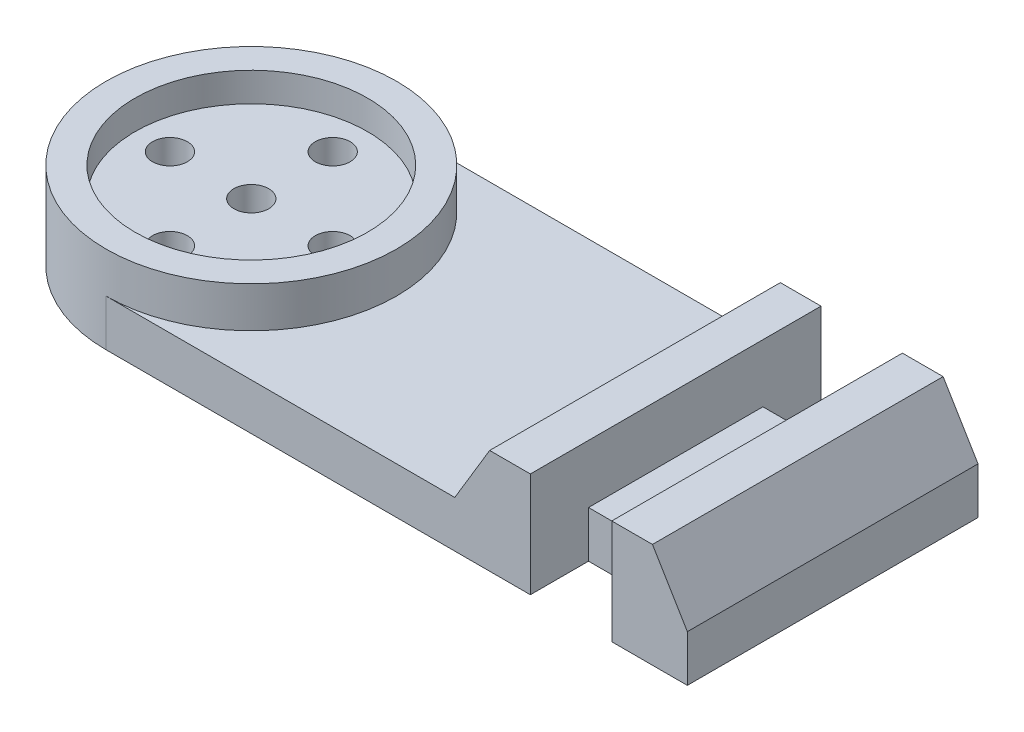
ISO-10303-21;
HEADER;
FILE_DESCRIPTION(('STEP AP214'),'2;1');
FILE_NAME('part.step','',(''),(''),'','','');
FILE_SCHEMA(('AUTOMOTIVE_DESIGN { 1 0 10303 214 1 1 1 1 }'));
ENDSEC;
DATA;
#1=APPLICATION_CONTEXT('core data for automotive mechanical design processes');
#2=APPLICATION_PROTOCOL_DEFINITION('international standard','automotive_design',2000,#1);
#3=PRODUCT_CONTEXT('',#1,'mechanical');
#4=PRODUCT('Part','Part','',(#3));
#5=PRODUCT_RELATED_PRODUCT_CATEGORY('part','',(#4));
#6=PRODUCT_DEFINITION_FORMATION('','',#4);
#7=PRODUCT_DEFINITION_CONTEXT('part definition',#1,'design');
#8=PRODUCT_DEFINITION('design','',#6,#7);
#9=PRODUCT_DEFINITION_SHAPE('','',#8);
#10=(LENGTH_UNIT() NAMED_UNIT(*) SI_UNIT(.MILLI.,.METRE.));
#11=(NAMED_UNIT(*) PLANE_ANGLE_UNIT() SI_UNIT($,.RADIAN.));
#12=(NAMED_UNIT(*) SI_UNIT($,.STERADIAN.) SOLID_ANGLE_UNIT());
#13=UNCERTAINTY_MEASURE_WITH_UNIT(LENGTH_MEASURE(1.E-05),#10,'distance_accuracy_value','');
#14=(GEOMETRIC_REPRESENTATION_CONTEXT(3) GLOBAL_UNCERTAINTY_ASSIGNED_CONTEXT((#13)) GLOBAL_UNIT_ASSIGNED_CONTEXT((#10,
#11,#12)) REPRESENTATION_CONTEXT('',''));
#15=CARTESIAN_POINT('',(0.,0.,0.));
#16=DIRECTION('',(0.,0.,1.));
#17=DIRECTION('',(1.,0.,0.));
#18=AXIS2_PLACEMENT_3D('',#15,#16,#17);
#19=CARTESIAN_POINT('',(0.,4.,12.5));
#20=DIRECTION('',(0.,0.,-1.));
#21=DIRECTION('',(-1.,0.,0.));
#22=AXIS2_PLACEMENT_3D('',#19,#20,#21);
#23=PLANE('',#22);
#24=DIRECTION('',(1.,0.,0.));
#25=VECTOR('',#24,1.);
#26=CARTESIAN_POINT('',(0.,0.,12.5));
#27=LINE('',#26,#25);
#28=CARTESIAN_POINT('',(0.,0.,12.5));
#29=VERTEX_POINT('',#28);
#30=CARTESIAN_POINT('',(36.5,0.,12.5));
#31=VERTEX_POINT('',#30);
#32=EDGE_CURVE('E159',#29,#31,#27,.T.);
#33=ORIENTED_EDGE('',*,*,#32,.T.);
#34=DIRECTION('',(0.,-1.,0.));
#35=VECTOR('',#34,1.);
#36=CARTESIAN_POINT('',(36.5,9.,12.5));
#37=LINE('',#36,#35);
#38=CARTESIAN_POINT('',(36.5,9.,12.5));
#39=VERTEX_POINT('',#38);
#40=EDGE_CURVE('E143',#39,#31,#37,.T.);
#41=ORIENTED_EDGE('',*,*,#40,.F.);
#42=DIRECTION('',(-1.,0.,0.));
#43=VECTOR('',#42,1.);
#44=CARTESIAN_POINT('',(47.,9.,12.5));
#45=LINE('',#44,#43);
#46=CARTESIAN_POINT('',(33.,9.,12.5));
#47=VERTEX_POINT('',#46);
#48=EDGE_CURVE('E268',#39,#47,#45,.T.);
#49=ORIENTED_EDGE('',*,*,#48,.T.);
#50=DIRECTION('',(-0.514495755427526,-0.857492925712544,0.));
#51=VECTOR('',#50,1.);
#52=CARTESIAN_POINT('',(30.,4.,12.5));
#53=LINE('',#52,#51);
#54=CARTESIAN_POINT('',(30.,4.,12.5));
#55=VERTEX_POINT('',#54);
#56=EDGE_CURVE('E216',#47,#55,#53,.T.);
#57=ORIENTED_EDGE('',*,*,#56,.T.);
#58=DIRECTION('',(1.,0.,0.));
#59=VECTOR('',#58,1.);
#60=CARTESIAN_POINT('',(0.,4.,12.5));
#61=LINE('',#60,#59);
#62=CARTESIAN_POINT('',(0.,4.,12.5));
#63=VERTEX_POINT('',#62);
#64=EDGE_CURVE('E181',#63,#55,#61,.T.);
#65=ORIENTED_EDGE('',*,*,#64,.F.);
#66=DIRECTION('',(0.,-1.,0.));
#67=VECTOR('',#66,1.);
#68=CARTESIAN_POINT('',(0.,4.,12.5));
#69=LINE('',#68,#67);
#70=EDGE_CURVE('E45',#63,#29,#69,.T.);
#71=ORIENTED_EDGE('',*,*,#70,.T.);
#72=EDGE_LOOP('',(#33,#41,#49,#57,#65,#71));
#73=FACE_BOUND('',#72,.T.);
#74=ADVANCED_FACE('F37',(#73),#23,.F.);
#75=CARTESIAN_POINT('',(0.,4.,-12.5));
#76=DIRECTION('',(0.,0.,-1.));
#77=DIRECTION('',(-1.,0.,0.));
#78=AXIS2_PLACEMENT_3D('',#75,#76,#77);
#79=PLANE('',#78);
#80=DIRECTION('',(0.,-1.,0.));
#81=VECTOR('',#80,1.);
#82=CARTESIAN_POINT('',(36.5,9.,-12.5));
#83=LINE('',#82,#81);
#84=CARTESIAN_POINT('',(36.5,9.,-12.5));
#85=VERTEX_POINT('',#84);
#86=CARTESIAN_POINT('',(36.5,0.,-12.5));
#87=VERTEX_POINT('',#86);
#88=EDGE_CURVE('E60',#85,#87,#83,.T.);
#89=ORIENTED_EDGE('',*,*,#88,.T.);
#90=DIRECTION('',(1.,0.,0.));
#91=VECTOR('',#90,1.);
#92=CARTESIAN_POINT('',(0.,0.,-12.5));
#93=LINE('',#92,#91);
#94=CARTESIAN_POINT('',(0.,0.,-12.5));
#95=VERTEX_POINT('',#94);
#96=EDGE_CURVE('E178',#95,#87,#93,.T.);
#97=ORIENTED_EDGE('',*,*,#96,.F.);
#98=DIRECTION('',(0.,-1.,0.));
#99=VECTOR('',#98,1.);
#100=CARTESIAN_POINT('',(0.,4.,-12.5));
#101=LINE('',#100,#99);
#102=CARTESIAN_POINT('',(0.,4.,-12.5));
#103=VERTEX_POINT('',#102);
#104=EDGE_CURVE('E182',#103,#95,#101,.T.);
#105=ORIENTED_EDGE('',*,*,#104,.F.);
#106=DIRECTION('',(1.,0.,0.));
#107=VECTOR('',#106,1.);
#108=CARTESIAN_POINT('',(0.,4.,-12.5));
#109=LINE('',#108,#107);
#110=CARTESIAN_POINT('',(30.,4.,-12.5));
#111=VERTEX_POINT('',#110);
#112=EDGE_CURVE('E185',#103,#111,#109,.T.);
#113=ORIENTED_EDGE('',*,*,#112,.T.);
#114=DIRECTION('',(-0.514495755427526,-0.857492925712544,0.));
#115=VECTOR('',#114,1.);
#116=CARTESIAN_POINT('',(30.,4.,-12.5));
#117=LINE('',#116,#115);
#118=CARTESIAN_POINT('',(33.,9.,-12.5));
#119=VERTEX_POINT('',#118);
#120=EDGE_CURVE('E261',#119,#111,#117,.T.);
#121=ORIENTED_EDGE('',*,*,#120,.F.);
#122=DIRECTION('',(-1.,0.,0.));
#123=VECTOR('',#122,1.);
#124=CARTESIAN_POINT('',(47.,9.,-12.5));
#125=LINE('',#124,#123);
#126=EDGE_CURVE('E257',#85,#119,#125,.T.);
#127=ORIENTED_EDGE('',*,*,#126,.F.);
#128=EDGE_LOOP('',(#89,#97,#105,#113,#121,#127));
#129=FACE_BOUND('',#128,.T.);
#130=ADVANCED_FACE('F337',(#129),#79,.T.);
#131=CARTESIAN_POINT('',(47.,9.,-33.1155281280883));
#132=DIRECTION('',(0.,1.,0.));
#133=DIRECTION('',(-1.,0.,0.));
#134=AXIS2_PLACEMENT_3D('',#131,#132,#133);
#135=PLANE('',#134);
#136=DIRECTION('',(0.,0.,1.));
#137=VECTOR('',#136,1.);
#138=CARTESIAN_POINT('',(43.5,9.,-12.5));
#139=LINE('',#138,#137);
#140=CARTESIAN_POINT('',(43.5,9.,-12.5));
#141=VERTEX_POINT('',#140);
#142=CARTESIAN_POINT('',(43.5,9.,12.5));
#143=VERTEX_POINT('',#142);
#144=EDGE_CURVE('E274',#141,#143,#139,.T.);
#145=ORIENTED_EDGE('',*,*,#144,.T.);
#146=CARTESIAN_POINT('',(47.,9.,12.5));
#147=VERTEX_POINT('',#146);
#148=EDGE_CURVE('E269',#147,#143,#45,.T.);
#149=ORIENTED_EDGE('',*,*,#148,.F.);
#150=DIRECTION('',(0.,0.,1.));
#151=VECTOR('',#150,1.);
#152=CARTESIAN_POINT('',(47.,9.,-33.1155281280883));
#153=LINE('',#152,#151);
#154=CARTESIAN_POINT('',(47.,9.,-12.5));
#155=VERTEX_POINT('',#154);
#156=EDGE_CURVE('E215',#155,#147,#153,.T.);
#157=ORIENTED_EDGE('',*,*,#156,.F.);
#158=EDGE_CURVE('E212',#155,#141,#125,.T.);
#159=ORIENTED_EDGE('',*,*,#158,.T.);
#160=EDGE_LOOP('',(#145,#149,#157,#159));
#161=FACE_BOUND('',#160,.T.);
#162=ADVANCED_FACE('F342',(#161),#135,.T.);
#163=CARTESIAN_POINT('',(0.,4.,0.));
#164=DIRECTION('',(0.,-1.,0.));
#165=DIRECTION('',(0.,0.,-1.));
#166=AXIS2_PLACEMENT_3D('',#163,#164,#165);
#167=CYLINDRICAL_SURFACE('',#166,12.5);
#168=CARTESIAN_POINT('',(0.,0.,0.));
#169=DIRECTION('',(0.,1.,0.));
#170=DIRECTION('',(0.,0.,1.));
#171=AXIS2_PLACEMENT_3D('',#168,#169,#170);
#172=CIRCLE('',#171,12.5);
#173=EDGE_CURVE('E174',#95,#29,#172,.T.);
#174=ORIENTED_EDGE('',*,*,#173,.T.);
#175=ORIENTED_EDGE('',*,*,#70,.F.);
#176=CARTESIAN_POINT('',(0.,4.,0.));
#177=DIRECTION('',(0.,1.,0.));
#178=DIRECTION('',(0.,0.,1.));
#179=AXIS2_PLACEMENT_3D('',#176,#177,#178);
#180=CIRCLE('',#179,12.5);
#181=EDGE_CURVE('E224',#63,#103,#180,.T.);
#182=ORIENTED_EDGE('',*,*,#181,.T.);
#183=ORIENTED_EDGE('',*,*,#104,.T.);
#184=EDGE_LOOP('',(#174,#175,#182,#183));
#185=FACE_BOUND('',#184,.T.);
#186=CARTESIAN_POINT('',(0.,7.5,0.));
#187=DIRECTION('',(0.,1.,0.));
#188=DIRECTION('',(0.,0.,1.));
#189=AXIS2_PLACEMENT_3D('',#186,#187,#188);
#190=CIRCLE('',#189,12.5);
#191=CARTESIAN_POINT('',(0.,7.5,12.5));
#192=VERTEX_POINT('',#191);
#193=EDGE_CURVE('E227',#192,#192,#190,.T.);
#194=ORIENTED_EDGE('',*,*,#193,.F.);
#195=EDGE_LOOP('',(#194));
#196=FACE_BOUND('',#195,.T.);
#197=ADVANCED_FACE('F39',(#185,#196),#167,.T.);
#198=DIRECTION('',(0.,1.,0.));
#199=VECTOR('',#198,1.);
#200=CARTESIAN_POINT('',(43.5,9.,12.5));
#201=LINE('',#200,#199);
#202=CARTESIAN_POINT('',(43.5,0.,12.5));
#203=VERTEX_POINT('',#202);
#204=EDGE_CURVE('E153',#203,#143,#201,.T.);
#205=ORIENTED_EDGE('',*,*,#204,.F.);
#206=CARTESIAN_POINT('',(50.,0.,12.5));
#207=VERTEX_POINT('',#206);
#208=EDGE_CURVE('E169',#203,#207,#27,.T.);
#209=ORIENTED_EDGE('',*,*,#208,.T.);
#210=DIRECTION('',(0.,-1.,0.));
#211=VECTOR('',#210,1.);
#212=CARTESIAN_POINT('',(50.,4.,12.5));
#213=LINE('',#212,#211);
#214=CARTESIAN_POINT('',(50.,4.,12.5));
#215=VERTEX_POINT('',#214);
#216=EDGE_CURVE('E188',#215,#207,#213,.T.);
#217=ORIENTED_EDGE('',*,*,#216,.F.);
#218=DIRECTION('',(-0.514495755427527,0.857492925712544,0.));
#219=VECTOR('',#218,1.);
#220=CARTESIAN_POINT('',(50.,4.,12.5));
#221=LINE('',#220,#219);
#222=EDGE_CURVE('E219',#215,#147,#221,.T.);
#223=ORIENTED_EDGE('',*,*,#222,.T.);
#224=ORIENTED_EDGE('',*,*,#148,.T.);
#225=EDGE_LOOP('',(#205,#209,#217,#223,#224));
#226=FACE_BOUND('',#225,.T.);
#227=ADVANCED_FACE('F338',(#226),#23,.F.);
#228=CARTESIAN_POINT('',(50.,4.,0.));
#229=DIRECTION('',(1.,0.,0.));
#230=DIRECTION('',(0.,0.,-1.));
#231=AXIS2_PLACEMENT_3D('',#228,#229,#230);
#232=PLANE('',#231);
#233=DIRECTION('',(0.,0.,1.));
#234=VECTOR('',#233,1.);
#235=CARTESIAN_POINT('',(50.,0.,0.));
#236=LINE('',#235,#234);
#237=CARTESIAN_POINT('',(50.,0.,-12.5));
#238=VERTEX_POINT('',#237);
#239=EDGE_CURVE('E168',#238,#207,#236,.T.);
#240=ORIENTED_EDGE('',*,*,#239,.F.);
#241=DIRECTION('',(0.,-1.,0.));
#242=VECTOR('',#241,1.);
#243=CARTESIAN_POINT('',(50.,4.,-12.5));
#244=LINE('',#243,#242);
#245=CARTESIAN_POINT('',(50.,4.,-12.5));
#246=VERTEX_POINT('',#245);
#247=EDGE_CURVE('E184',#246,#238,#244,.T.);
#248=ORIENTED_EDGE('',*,*,#247,.F.);
#249=DIRECTION('',(0.,0.,1.));
#250=VECTOR('',#249,1.);
#251=CARTESIAN_POINT('',(50.,4.,0.));
#252=LINE('',#251,#250);
#253=EDGE_CURVE('E195',#246,#215,#252,.T.);
#254=ORIENTED_EDGE('',*,*,#253,.T.);
#255=ORIENTED_EDGE('',*,*,#216,.T.);
#256=EDGE_LOOP('',(#240,#248,#254,#255));
#257=FACE_BOUND('',#256,.T.);
#258=ADVANCED_FACE('F193',(#257),#232,.T.);
#259=CARTESIAN_POINT('',(43.5,0.,-12.5));
#260=VERTEX_POINT('',#259);
#261=EDGE_CURVE('E172',#260,#238,#93,.T.);
#262=ORIENTED_EDGE('',*,*,#261,.F.);
#263=DIRECTION('',(0.,1.,0.));
#264=VECTOR('',#263,1.);
#265=CARTESIAN_POINT('',(43.5,9.,-12.5));
#266=LINE('',#265,#264);
#267=EDGE_CURVE('E152',#260,#141,#266,.T.);
#268=ORIENTED_EDGE('',*,*,#267,.T.);
#269=ORIENTED_EDGE('',*,*,#158,.F.);
#270=DIRECTION('',(-0.514495755427527,0.857492925712544,0.));
#271=VECTOR('',#270,1.);
#272=CARTESIAN_POINT('',(50.,4.,-12.5));
#273=LINE('',#272,#271);
#274=EDGE_CURVE('E210',#246,#155,#273,.T.);
#275=ORIENTED_EDGE('',*,*,#274,.F.);
#276=ORIENTED_EDGE('',*,*,#247,.T.);
#277=EDGE_LOOP('',(#262,#268,#269,#275,#276));
#278=FACE_BOUND('',#277,.T.);
#279=ADVANCED_FACE('F208',(#278),#79,.T.);
#280=CARTESIAN_POINT('',(0.,4.,0.));
#281=DIRECTION('',(0.,1.,0.));
#282=DIRECTION('',(0.,0.,1.));
#283=AXIS2_PLACEMENT_3D('',#280,#281,#282);
#284=PLANE('',#283);
#285=DIRECTION('',(0.,0.,1.));
#286=VECTOR('',#285,1.);
#287=CARTESIAN_POINT('',(30.,4.,-33.1155281280883));
#288=LINE('',#287,#286);
#289=EDGE_CURVE('E241',#111,#55,#288,.T.);
#290=ORIENTED_EDGE('',*,*,#289,.F.);
#291=ORIENTED_EDGE('',*,*,#112,.F.);
#292=ORIENTED_EDGE('',*,*,#181,.F.);
#293=ORIENTED_EDGE('',*,*,#64,.T.);
#294=EDGE_LOOP('',(#290,#291,#292,#293));
#295=FACE_BOUND('',#294,.T.);
#296=ADVANCED_FACE('F376',(#295),#284,.T.);
#297=CARTESIAN_POINT('',(0.,0.,0.));
#298=DIRECTION('',(0.,1.,0.));
#299=DIRECTION('',(0.,0.,1.));
#300=AXIS2_PLACEMENT_3D('',#297,#298,#299);
#301=PLANE('',#300);
#302=DIRECTION('',(-1.,0.,0.));
#303=VECTOR('',#302,1.);
#304=CARTESIAN_POINT('',(43.5,0.,7.5));
#305=LINE('',#304,#303);
#306=CARTESIAN_POINT('',(43.5,0.,7.5));
#307=VERTEX_POINT('',#306);
#308=CARTESIAN_POINT('',(36.5,0.,7.5));
#309=VERTEX_POINT('',#308);
#310=EDGE_CURVE('E163',#307,#309,#305,.T.);
#311=ORIENTED_EDGE('',*,*,#310,.T.);
#312=DIRECTION('',(0.,0.,1.));
#313=VECTOR('',#312,1.);
#314=CARTESIAN_POINT('',(36.5,0.,7.5));
#315=LINE('',#314,#313);
#316=EDGE_CURVE('E146',#309,#31,#315,.T.);
#317=ORIENTED_EDGE('',*,*,#316,.T.);
#318=ORIENTED_EDGE('',*,*,#32,.F.);
#319=ORIENTED_EDGE('',*,*,#173,.F.);
#320=ORIENTED_EDGE('',*,*,#96,.T.);
#321=DIRECTION('',(0.,0.,1.));
#322=VECTOR('',#321,1.);
#323=CARTESIAN_POINT('',(36.5,0.,-7.5));
#324=LINE('',#323,#322);
#325=CARTESIAN_POINT('',(36.5,0.,-7.5));
#326=VERTEX_POINT('',#325);
#327=EDGE_CURVE('E294',#87,#326,#324,.T.);
#328=ORIENTED_EDGE('',*,*,#327,.T.);
#329=DIRECTION('',(1.,0.,0.));
#330=VECTOR('',#329,1.);
#331=CARTESIAN_POINT('',(43.5,0.,-7.5));
#332=LINE('',#331,#330);
#333=CARTESIAN_POINT('',(43.5,0.,-7.5));
#334=VERTEX_POINT('',#333);
#335=EDGE_CURVE('E297',#326,#334,#332,.T.);
#336=ORIENTED_EDGE('',*,*,#335,.T.);
#337=DIRECTION('',(0.,0.,-1.));
#338=VECTOR('',#337,1.);
#339=CARTESIAN_POINT('',(43.5,0.,-12.5));
#340=LINE('',#339,#338);
#341=EDGE_CURVE('E204',#334,#260,#340,.T.);
#342=ORIENTED_EDGE('',*,*,#341,.T.);
#343=ORIENTED_EDGE('',*,*,#261,.T.);
#344=ORIENTED_EDGE('',*,*,#239,.T.);
#345=ORIENTED_EDGE('',*,*,#208,.F.);
#346=DIRECTION('',(0.,0.,-1.));
#347=VECTOR('',#346,1.);
#348=CARTESIAN_POINT('',(43.5,0.,12.5));
#349=LINE('',#348,#347);
#350=EDGE_CURVE('E164',#203,#307,#349,.T.);
#351=ORIENTED_EDGE('',*,*,#350,.T.);
#352=EDGE_LOOP('',(#311,#317,#318,#319,#320,#328,#336,#342,#343,#344,#345,#351));
#353=FACE_BOUND('',#352,.T.);
#354=CARTESIAN_POINT('',(40.,0.,0.));
#355=DIRECTION('',(0.,-1.,0.));
#356=DIRECTION('',(0.,0.,-1.));
#357=AXIS2_PLACEMENT_3D('',#354,#355,#356);
#358=CIRCLE('',#357,1.5);
#359=CARTESIAN_POINT('',(40.,0.,-1.5));
#360=VERTEX_POINT('',#359);
#361=EDGE_CURVE('E237',#360,#360,#358,.T.);
#362=ORIENTED_EDGE('',*,*,#361,.F.);
#363=EDGE_LOOP('',(#362));
#364=FACE_BOUND('',#363,.T.);
#365=CARTESIAN_POINT('',(0.,0.,7.));
#366=DIRECTION('',(0.,-1.,0.));
#367=DIRECTION('',(0.,0.,-1.));
#368=AXIS2_PLACEMENT_3D('',#365,#366,#367);
#369=CIRCLE('',#368,1.5);
#370=CARTESIAN_POINT('',(0.,0.,5.5));
#371=VERTEX_POINT('',#370);
#372=EDGE_CURVE('E236',#371,#371,#369,.T.);
#373=ORIENTED_EDGE('',*,*,#372,.F.);
#374=EDGE_LOOP('',(#373));
#375=FACE_BOUND('',#374,.T.);
#376=CARTESIAN_POINT('',(7.,0.,0.));
#377=DIRECTION('',(0.,-1.,0.));
#378=DIRECTION('',(0.,0.,-1.));
#379=AXIS2_PLACEMENT_3D('',#376,#377,#378);
#380=CIRCLE('',#379,1.5);
#381=CARTESIAN_POINT('',(7.,0.,-1.50000000000003));
#382=VERTEX_POINT('',#381);
#383=EDGE_CURVE('E242',#382,#382,#380,.T.);
#384=ORIENTED_EDGE('',*,*,#383,.F.);
#385=EDGE_LOOP('',(#384));
#386=FACE_BOUND('',#385,.T.);
#387=CARTESIAN_POINT('',(3.96556555700551E-13,0.,-7.));
#388=DIRECTION('',(0.,-1.,0.));
#389=DIRECTION('',(0.,0.,-1.));
#390=AXIS2_PLACEMENT_3D('',#387,#388,#389);
#391=CIRCLE('',#390,1.50000000000043);
#392=CARTESIAN_POINT('',(3.96556555700551E-13,0.,-8.50000000000043));
#393=VERTEX_POINT('',#392);
#394=EDGE_CURVE('E245',#393,#393,#391,.T.);
#395=ORIENTED_EDGE('',*,*,#394,.F.);
#396=EDGE_LOOP('',(#395));
#397=FACE_BOUND('',#396,.T.);
#398=CARTESIAN_POINT('',(-7.,0.,0.));
#399=DIRECTION('',(0.,-1.,0.));
#400=DIRECTION('',(0.,0.,-1.));
#401=AXIS2_PLACEMENT_3D('',#398,#399,#400);
#402=CIRCLE('',#401,1.5);
#403=CARTESIAN_POINT('',(-7.,0.,-1.49999999999993));
#404=VERTEX_POINT('',#403);
#405=EDGE_CURVE('E240',#404,#404,#402,.T.);
#406=ORIENTED_EDGE('',*,*,#405,.F.);
#407=EDGE_LOOP('',(#406));
#408=FACE_BOUND('',#407,.T.);
#409=CARTESIAN_POINT('',(0.,0.,0.));
#410=DIRECTION('',(0.,-1.,0.));
#411=DIRECTION('',(0.,0.,-1.));
#412=AXIS2_PLACEMENT_3D('',#409,#410,#411);
#413=CIRCLE('',#412,1.5);
#414=CARTESIAN_POINT('',(0.,0.,-1.5));
#415=VERTEX_POINT('',#414);
#416=EDGE_CURVE('E233',#415,#415,#413,.T.);
#417=ORIENTED_EDGE('',*,*,#416,.F.);
#418=EDGE_LOOP('',(#417));
#419=FACE_BOUND('',#418,.T.);
#420=ADVANCED_FACE('F156',(#353,#364,#375,#386,#397,#408,#419),#301,.F.);
#421=CARTESIAN_POINT('',(0.,7.5,0.));
#422=DIRECTION('',(0.,1.,0.));
#423=DIRECTION('',(0.,0.,1.));
#424=AXIS2_PLACEMENT_3D('',#421,#422,#423);
#425=PLANE('',#424);
#426=ORIENTED_EDGE('',*,*,#193,.T.);
#427=EDGE_LOOP('',(#426));
#428=FACE_BOUND('',#427,.T.);
#429=CARTESIAN_POINT('',(0.,7.5,0.));
#430=DIRECTION('',(0.,1.,0.));
#431=DIRECTION('',(0.,0.,1.));
#432=AXIS2_PLACEMENT_3D('',#429,#430,#431);
#433=CIRCLE('',#432,10.);
#434=CARTESIAN_POINT('',(0.,7.5,10.));
#435=VERTEX_POINT('',#434);
#436=EDGE_CURVE('E228',#435,#435,#433,.T.);
#437=ORIENTED_EDGE('',*,*,#436,.F.);
#438=EDGE_LOOP('',(#437));
#439=FACE_BOUND('',#438,.T.);
#440=ADVANCED_FACE('F380',(#428,#439),#425,.T.);
#441=CARTESIAN_POINT('',(0.,7.5,0.));
#442=DIRECTION('',(0.,-1.,0.));
#443=DIRECTION('',(0.,0.,-1.));
#444=AXIS2_PLACEMENT_3D('',#441,#442,#443);
#445=CYLINDRICAL_SURFACE('',#444,10.);
#446=CARTESIAN_POINT('',(0.,5.,0.));
#447=DIRECTION('',(0.,1.,0.));
#448=DIRECTION('',(0.,0.,1.));
#449=AXIS2_PLACEMENT_3D('',#446,#447,#448);
#450=CIRCLE('',#449,10.);
#451=CARTESIAN_POINT('',(0.,5.,10.));
#452=VERTEX_POINT('',#451);
#453=EDGE_CURVE('E11',#452,#452,#450,.T.);
#454=ORIENTED_EDGE('',*,*,#453,.F.);
#455=EDGE_LOOP('',(#454));
#456=FACE_BOUND('',#455,.T.);
#457=ORIENTED_EDGE('',*,*,#436,.T.);
#458=EDGE_LOOP('',(#457));
#459=FACE_BOUND('',#458,.T.);
#460=ADVANCED_FACE('F383',(#456,#459),#445,.F.);
#461=CARTESIAN_POINT('',(0.,7.5,0.));
#462=DIRECTION('',(0.,-1.,0.));
#463=DIRECTION('',(0.,0.,-1.));
#464=AXIS2_PLACEMENT_3D('',#461,#462,#463);
#465=CYLINDRICAL_SURFACE('',#464,1.5);
#466=ORIENTED_EDGE('',*,*,#416,.T.);
#467=EDGE_LOOP('',(#466));
#468=FACE_BOUND('',#467,.T.);
#469=CARTESIAN_POINT('',(0.,5.,0.));
#470=DIRECTION('',(0.,1.,0.));
#471=DIRECTION('',(0.,0.,1.));
#472=AXIS2_PLACEMENT_3D('',#469,#470,#471);
#473=CIRCLE('',#472,1.5);
#474=CARTESIAN_POINT('',(0.,5.,1.5));
#475=VERTEX_POINT('',#474);
#476=EDGE_CURVE('E295',#475,#475,#473,.T.);
#477=ORIENTED_EDGE('',*,*,#476,.T.);
#478=EDGE_LOOP('',(#477));
#479=FACE_BOUND('',#478,.T.);
#480=ADVANCED_FACE('F388',(#468,#479),#465,.F.);
#481=CARTESIAN_POINT('',(-7.,7.5,0.));
#482=DIRECTION('',(0.,-1.,0.));
#483=DIRECTION('',(0.,0.,-1.));
#484=AXIS2_PLACEMENT_3D('',#481,#482,#483);
#485=CYLINDRICAL_SURFACE('',#484,1.5);
#486=ORIENTED_EDGE('',*,*,#405,.T.);
#487=EDGE_LOOP('',(#486));
#488=FACE_BOUND('',#487,.T.);
#489=CARTESIAN_POINT('',(-7.,5.,0.));
#490=DIRECTION('',(0.,1.,0.));
#491=DIRECTION('',(0.,0.,1.));
#492=AXIS2_PLACEMENT_3D('',#489,#490,#491);
#493=CIRCLE('',#492,1.5);
#494=CARTESIAN_POINT('',(-7.,5.,1.50000000000008));
#495=VERTEX_POINT('',#494);
#496=EDGE_CURVE('E318',#495,#495,#493,.T.);
#497=ORIENTED_EDGE('',*,*,#496,.T.);
#498=EDGE_LOOP('',(#497));
#499=FACE_BOUND('',#498,.T.);
#500=ADVANCED_FACE('F322',(#488,#499),#485,.F.);
#501=CARTESIAN_POINT('',(3.96556555700551E-13,7.5,-7.));
#502=DIRECTION('',(0.,-1.,0.));
#503=DIRECTION('',(0.,0.,-1.));
#504=AXIS2_PLACEMENT_3D('',#501,#502,#503);
#505=CYLINDRICAL_SURFACE('',#504,1.50000000000043);
#506=ORIENTED_EDGE('',*,*,#394,.T.);
#507=EDGE_LOOP('',(#506));
#508=FACE_BOUND('',#507,.T.);
#509=CARTESIAN_POINT('',(3.96556555700551E-13,5.,-7.));
#510=DIRECTION('',(0.,1.,0.));
#511=DIRECTION('',(0.,0.,1.));
#512=AXIS2_PLACEMENT_3D('',#509,#510,#511);
#513=CIRCLE('',#512,1.50000000000043);
#514=CARTESIAN_POINT('',(3.96556555700551E-13,5.,-5.49999999999957));
#515=VERTEX_POINT('',#514);
#516=EDGE_CURVE('E309',#515,#515,#513,.T.);
#517=ORIENTED_EDGE('',*,*,#516,.T.);
#518=EDGE_LOOP('',(#517));
#519=FACE_BOUND('',#518,.T.);
#520=ADVANCED_FACE('F580',(#508,#519),#505,.F.);
#521=CARTESIAN_POINT('',(7.,7.5,0.));
#522=DIRECTION('',(0.,-1.,0.));
#523=DIRECTION('',(0.,0.,-1.));
#524=AXIS2_PLACEMENT_3D('',#521,#522,#523);
#525=CYLINDRICAL_SURFACE('',#524,1.5);
#526=ORIENTED_EDGE('',*,*,#383,.T.);
#527=EDGE_LOOP('',(#526));
#528=FACE_BOUND('',#527,.T.);
#529=CARTESIAN_POINT('',(7.,5.,0.));
#530=DIRECTION('',(0.,1.,0.));
#531=DIRECTION('',(0.,0.,1.));
#532=AXIS2_PLACEMENT_3D('',#529,#530,#531);
#533=CIRCLE('',#532,1.5);
#534=CARTESIAN_POINT('',(7.,5.,1.49999999999997));
#535=VERTEX_POINT('',#534);
#536=EDGE_CURVE('E312',#535,#535,#533,.T.);
#537=ORIENTED_EDGE('',*,*,#536,.T.);
#538=EDGE_LOOP('',(#537));
#539=FACE_BOUND('',#538,.T.);
#540=ADVANCED_FACE('F591',(#528,#539),#525,.F.);
#541=CARTESIAN_POINT('',(0.,7.5,7.));
#542=DIRECTION('',(0.,-1.,0.));
#543=DIRECTION('',(0.,0.,-1.));
#544=AXIS2_PLACEMENT_3D('',#541,#542,#543);
#545=CYLINDRICAL_SURFACE('',#544,1.5);
#546=ORIENTED_EDGE('',*,*,#372,.T.);
#547=EDGE_LOOP('',(#546));
#548=FACE_BOUND('',#547,.T.);
#549=CARTESIAN_POINT('',(0.,5.,7.));
#550=DIRECTION('',(0.,1.,0.));
#551=DIRECTION('',(0.,0.,1.));
#552=AXIS2_PLACEMENT_3D('',#549,#550,#551);
#553=CIRCLE('',#552,1.5);
#554=CARTESIAN_POINT('',(0.,5.,8.5));
#555=VERTEX_POINT('',#554);
#556=EDGE_CURVE('E315',#555,#555,#553,.T.);
#557=ORIENTED_EDGE('',*,*,#556,.T.);
#558=EDGE_LOOP('',(#557));
#559=FACE_BOUND('',#558,.T.);
#560=ADVANCED_FACE('F434',(#548,#559),#545,.F.);
#561=CARTESIAN_POINT('',(40.,7.5,0.));
#562=DIRECTION('',(0.,-1.,0.));
#563=DIRECTION('',(0.,0.,-1.));
#564=AXIS2_PLACEMENT_3D('',#561,#562,#563);
#565=CYLINDRICAL_SURFACE('',#564,1.5);
#566=CARTESIAN_POINT('',(40.,4.,0.));
#567=DIRECTION('',(0.,-1.,0.));
#568=DIRECTION('',(1.,0.,0.));
#569=AXIS2_PLACEMENT_3D('',#566,#567,#568);
#570=CIRCLE('',#569,1.5);
#571=CARTESIAN_POINT('',(41.5,4.,0.));
#572=VERTEX_POINT('',#571);
#573=EDGE_CURVE('E252',#572,#572,#570,.F.);
#574=ORIENTED_EDGE('',*,*,#573,.T.);
#575=EDGE_LOOP('',(#574));
#576=FACE_BOUND('',#575,.T.);
#577=ORIENTED_EDGE('',*,*,#361,.T.);
#578=EDGE_LOOP('',(#577));
#579=FACE_BOUND('',#578,.T.);
#580=ADVANCED_FACE('F430',(#576,#579),#565,.F.);
#581=CARTESIAN_POINT('',(50.,4.,-33.1155281280883));
#582=DIRECTION('',(0.857492925712544,0.514495755427527,0.));
#583=DIRECTION('',(-0.514495755427527,0.857492925712544,0.));
#584=AXIS2_PLACEMENT_3D('',#581,#582,#583);
#585=PLANE('',#584);
#586=ORIENTED_EDGE('',*,*,#253,.F.);
#587=ORIENTED_EDGE('',*,*,#274,.T.);
#588=ORIENTED_EDGE('',*,*,#156,.T.);
#589=ORIENTED_EDGE('',*,*,#222,.F.);
#590=EDGE_LOOP('',(#586,#587,#588,#589));
#591=FACE_BOUND('',#590,.T.);
#592=ADVANCED_FACE('F218',(#591),#585,.T.);
#593=DIRECTION('',(0.,0.,1.));
#594=VECTOR('',#593,1.);
#595=CARTESIAN_POINT('',(36.5,9.,-12.5));
#596=LINE('',#595,#594);
#597=EDGE_CURVE('E148',#85,#39,#596,.T.);
#598=ORIENTED_EDGE('',*,*,#597,.F.);
#599=ORIENTED_EDGE('',*,*,#126,.T.);
#600=DIRECTION('',(0.,0.,1.));
#601=VECTOR('',#600,1.);
#602=CARTESIAN_POINT('',(33.,9.,-33.1155281280883));
#603=LINE('',#602,#601);
#604=EDGE_CURVE('E258',#119,#47,#603,.T.);
#605=ORIENTED_EDGE('',*,*,#604,.T.);
#606=ORIENTED_EDGE('',*,*,#48,.F.);
#607=EDGE_LOOP('',(#598,#599,#605,#606));
#608=FACE_BOUND('',#607,.T.);
#609=ADVANCED_FACE('F370',(#608),#135,.T.);
#610=CARTESIAN_POINT('',(30.,4.,-33.1155281280883));
#611=DIRECTION('',(-0.857492925712544,0.514495755427526,0.));
#612=DIRECTION('',(-0.514495755427526,-0.857492925712544,0.));
#613=AXIS2_PLACEMENT_3D('',#610,#611,#612);
#614=PLANE('',#613);
#615=ORIENTED_EDGE('',*,*,#604,.F.);
#616=ORIENTED_EDGE('',*,*,#120,.T.);
#617=ORIENTED_EDGE('',*,*,#289,.T.);
#618=ORIENTED_EDGE('',*,*,#56,.F.);
#619=EDGE_LOOP('',(#615,#616,#617,#618));
#620=FACE_BOUND('',#619,.T.);
#621=ADVANCED_FACE('F374',(#620),#614,.T.);
#622=CARTESIAN_POINT('',(43.5,4.,-12.5));
#623=DIRECTION('',(0.,-1.,0.));
#624=DIRECTION('',(1.,0.,0.));
#625=AXIS2_PLACEMENT_3D('',#622,#623,#624);
#626=PLANE('',#625);
#627=DIRECTION('',(0.,0.,1.));
#628=VECTOR('',#627,1.);
#629=CARTESIAN_POINT('',(36.5,4.,-12.5));
#630=LINE('',#629,#628);
#631=CARTESIAN_POINT('',(36.5,4.00000000000002,-7.5));
#632=VERTEX_POINT('',#631);
#633=CARTESIAN_POINT('',(36.5,4.,7.5));
#634=VERTEX_POINT('',#633);
#635=EDGE_CURVE('E278',#632,#634,#630,.T.);
#636=ORIENTED_EDGE('',*,*,#635,.T.);
#637=DIRECTION('',(-1.,0.,0.));
#638=VECTOR('',#637,1.);
#639=CARTESIAN_POINT('',(43.5,4.00000000000003,7.5));
#640=LINE('',#639,#638);
#641=CARTESIAN_POINT('',(43.5,4.00000000000003,7.5));
#642=VERTEX_POINT('',#641);
#643=EDGE_CURVE('E52',#642,#634,#640,.T.);
#644=ORIENTED_EDGE('',*,*,#643,.F.);
#645=DIRECTION('',(0.,0.,1.));
#646=VECTOR('',#645,1.);
#647=CARTESIAN_POINT('',(43.5,4.,-12.5));
#648=LINE('',#647,#646);
#649=CARTESIAN_POINT('',(43.5,4.00000000000003,-7.5));
#650=VERTEX_POINT('',#649);
#651=EDGE_CURVE('E255',#650,#642,#648,.T.);
#652=ORIENTED_EDGE('',*,*,#651,.F.);
#653=DIRECTION('',(1.,0.,0.));
#654=VECTOR('',#653,1.);
#655=CARTESIAN_POINT('',(43.5,4.00000000000003,-7.5));
#656=LINE('',#655,#654);
#657=EDGE_CURVE('E291',#632,#650,#656,.T.);
#658=ORIENTED_EDGE('',*,*,#657,.F.);
#659=EDGE_LOOP('',(#636,#644,#652,#658));
#660=FACE_BOUND('',#659,.T.);
#661=ORIENTED_EDGE('',*,*,#573,.F.);
#662=EDGE_LOOP('',(#661));
#663=FACE_BOUND('',#662,.T.);
#664=ADVANCED_FACE('F360',(#660,#663),#626,.F.);
#665=CARTESIAN_POINT('',(43.5,9.,-12.5));
#666=DIRECTION('',(1.,0.,0.));
#667=DIRECTION('',(0.,0.,-1.));
#668=AXIS2_PLACEMENT_3D('',#665,#666,#667);
#669=PLANE('',#668);
#670=ORIENTED_EDGE('',*,*,#204,.T.);
#671=ORIENTED_EDGE('',*,*,#144,.F.);
#672=ORIENTED_EDGE('',*,*,#267,.F.);
#673=ORIENTED_EDGE('',*,*,#341,.F.);
#674=DIRECTION('',(0.,1.,0.));
#675=VECTOR('',#674,1.);
#676=CARTESIAN_POINT('',(43.5,0.,-7.5));
#677=LINE('',#676,#675);
#678=EDGE_CURVE('E289',#334,#650,#677,.T.);
#679=ORIENTED_EDGE('',*,*,#678,.T.);
#680=ORIENTED_EDGE('',*,*,#651,.T.);
#681=DIRECTION('',(0.,1.,0.));
#682=VECTOR('',#681,1.);
#683=CARTESIAN_POINT('',(43.5,0.,7.5));
#684=LINE('',#683,#682);
#685=EDGE_CURVE('E301',#307,#642,#684,.T.);
#686=ORIENTED_EDGE('',*,*,#685,.F.);
#687=ORIENTED_EDGE('',*,*,#350,.F.);
#688=EDGE_LOOP('',(#670,#671,#672,#673,#679,#680,#686,#687));
#689=FACE_BOUND('',#688,.T.);
#690=ADVANCED_FACE('F355',(#689),#669,.F.);
#691=CARTESIAN_POINT('',(36.5,9.,-12.5));
#692=DIRECTION('',(-1.,0.,0.));
#693=DIRECTION('',(0.,-1.,0.));
#694=AXIS2_PLACEMENT_3D('',#691,#692,#693);
#695=PLANE('',#694);
#696=ORIENTED_EDGE('',*,*,#40,.T.);
#697=ORIENTED_EDGE('',*,*,#316,.F.);
#698=DIRECTION('',(0.,1.,0.));
#699=VECTOR('',#698,1.);
#700=CARTESIAN_POINT('',(36.5,0.,7.5));
#701=LINE('',#700,#699);
#702=EDGE_CURVE('E284',#309,#634,#701,.T.);
#703=ORIENTED_EDGE('',*,*,#702,.T.);
#704=ORIENTED_EDGE('',*,*,#635,.F.);
#705=DIRECTION('',(0.,1.,0.));
#706=VECTOR('',#705,1.);
#707=CARTESIAN_POINT('',(36.5,0.,-7.5));
#708=LINE('',#707,#706);
#709=EDGE_CURVE('E287',#326,#632,#708,.T.);
#710=ORIENTED_EDGE('',*,*,#709,.F.);
#711=ORIENTED_EDGE('',*,*,#327,.F.);
#712=ORIENTED_EDGE('',*,*,#88,.F.);
#713=ORIENTED_EDGE('',*,*,#597,.T.);
#714=EDGE_LOOP('',(#696,#697,#703,#704,#710,#711,#712,#713));
#715=FACE_BOUND('',#714,.T.);
#716=ADVANCED_FACE('F145',(#715),#695,.F.);
#717=CARTESIAN_POINT('',(43.5,0.,-7.5));
#718=DIRECTION('',(0.,0.,1.));
#719=DIRECTION('',(1.,0.,0.));
#720=AXIS2_PLACEMENT_3D('',#717,#718,#719);
#721=PLANE('',#720);
#722=ORIENTED_EDGE('',*,*,#657,.T.);
#723=ORIENTED_EDGE('',*,*,#678,.F.);
#724=ORIENTED_EDGE('',*,*,#335,.F.);
#725=ORIENTED_EDGE('',*,*,#709,.T.);
#726=EDGE_LOOP('',(#722,#723,#724,#725));
#727=FACE_BOUND('',#726,.T.);
#728=ADVANCED_FACE('F332',(#727),#721,.F.);
#729=CARTESIAN_POINT('',(43.5,0.,7.5));
#730=DIRECTION('',(0.,0.,-1.));
#731=DIRECTION('',(-1.,0.,0.));
#732=AXIS2_PLACEMENT_3D('',#729,#730,#731);
#733=PLANE('',#732);
#734=ORIENTED_EDGE('',*,*,#643,.T.);
#735=ORIENTED_EDGE('',*,*,#702,.F.);
#736=ORIENTED_EDGE('',*,*,#310,.F.);
#737=ORIENTED_EDGE('',*,*,#685,.T.);
#738=EDGE_LOOP('',(#734,#735,#736,#737));
#739=FACE_BOUND('',#738,.T.);
#740=ADVANCED_FACE('F326',(#739),#733,.F.);
#741=CARTESIAN_POINT('',(0.,5.,0.));
#742=DIRECTION('',(0.,1.,0.));
#743=DIRECTION('',(0.,0.,1.));
#744=AXIS2_PLACEMENT_3D('',#741,#742,#743);
#745=PLANE('',#744);
#746=ORIENTED_EDGE('',*,*,#556,.F.);
#747=EDGE_LOOP('',(#746));
#748=FACE_BOUND('',#747,.T.);
#749=ORIENTED_EDGE('',*,*,#516,.F.);
#750=EDGE_LOOP('',(#749));
#751=FACE_BOUND('',#750,.T.);
#752=ORIENTED_EDGE('',*,*,#453,.T.);
#753=EDGE_LOOP('',(#752));
#754=FACE_BOUND('',#753,.T.);
#755=ORIENTED_EDGE('',*,*,#476,.F.);
#756=EDGE_LOOP('',(#755));
#757=FACE_BOUND('',#756,.T.);
#758=ORIENTED_EDGE('',*,*,#536,.F.);
#759=EDGE_LOOP('',(#758));
#760=FACE_BOUND('',#759,.T.);
#761=ORIENTED_EDGE('',*,*,#496,.F.);
#762=EDGE_LOOP('',(#761));
#763=FACE_BOUND('',#762,.T.);
#764=ADVANCED_FACE('F324',(#748,#751,#754,#757,#760,#763),#745,.T.);
#765=CLOSED_SHELL('',(#74,#130,#162,#197,#227,#258,#279,#296,#420,#440,#460,#480,#500,#520,#540,
#560,#580,#592,#609,#621,#664,#690,#716,#728,#740,#764));
#766=MANIFOLD_SOLID_BREP('B2',#765);
#767=ADVANCED_BREP_SHAPE_REPRESENTATION('',(#18,#766),#14);
#768=SHAPE_DEFINITION_REPRESENTATION(#9,#767);
ENDSEC;
END-ISO-10303-21;
